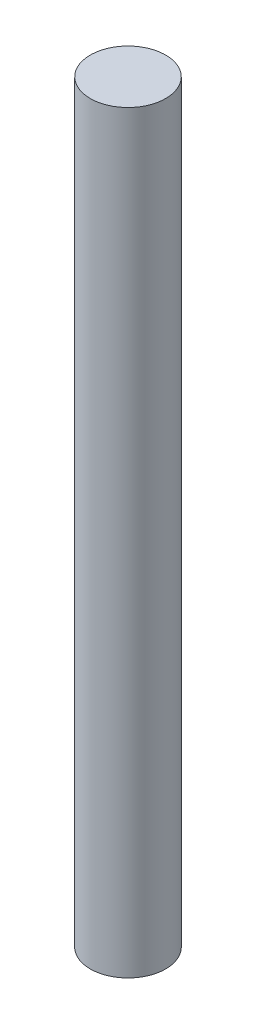
ISO-10303-21;
HEADER;
FILE_DESCRIPTION(('STEP AP214'),'2;1');
FILE_NAME('part.step','',(''),(''),'','','');
FILE_SCHEMA(('AUTOMOTIVE_DESIGN { 1 0 10303 214 1 1 1 1 }'));
ENDSEC;
DATA;
#1=APPLICATION_CONTEXT('core data for automotive mechanical design processes');
#2=APPLICATION_PROTOCOL_DEFINITION('international standard','automotive_design',2000,#1);
#3=PRODUCT_CONTEXT('',#1,'mechanical');
#4=PRODUCT('Part','Part','',(#3));
#5=PRODUCT_RELATED_PRODUCT_CATEGORY('part','',(#4));
#6=PRODUCT_DEFINITION_FORMATION('','',#4);
#7=PRODUCT_DEFINITION_CONTEXT('part definition',#1,'design');
#8=PRODUCT_DEFINITION('design','',#6,#7);
#9=PRODUCT_DEFINITION_SHAPE('','',#8);
#10=(LENGTH_UNIT() NAMED_UNIT(*) SI_UNIT(.MILLI.,.METRE.));
#11=(NAMED_UNIT(*) PLANE_ANGLE_UNIT() SI_UNIT($,.RADIAN.));
#12=(NAMED_UNIT(*) SI_UNIT($,.STERADIAN.) SOLID_ANGLE_UNIT());
#13=UNCERTAINTY_MEASURE_WITH_UNIT(LENGTH_MEASURE(1.E-05),#10,'distance_accuracy_value','');
#14=(GEOMETRIC_REPRESENTATION_CONTEXT(3) GLOBAL_UNCERTAINTY_ASSIGNED_CONTEXT((#13)) GLOBAL_UNIT_ASSIGNED_CONTEXT((#10,
#11,#12)) REPRESENTATION_CONTEXT('',''));
#15=CARTESIAN_POINT('',(0.,0.,0.));
#16=DIRECTION('',(0.,0.,1.));
#17=DIRECTION('',(1.,0.,0.));
#18=AXIS2_PLACEMENT_3D('',#15,#16,#17);
#19=CARTESIAN_POINT('',(0.,-10.,0.));
#20=DIRECTION('',(0.,1.,0.));
#21=DIRECTION('',(0.,0.,1.));
#22=AXIS2_PLACEMENT_3D('',#19,#20,#21);
#23=CYLINDRICAL_SURFACE('',#22,1.);
#24=CARTESIAN_POINT('',(0.,-10.,0.));
#25=DIRECTION('',(0.,1.,0.));
#26=DIRECTION('',(0.,0.,1.));
#27=AXIS2_PLACEMENT_3D('',#24,#25,#26);
#28=CIRCLE('',#27,1.);
#29=CARTESIAN_POINT('',(0.,-10.,1.));
#30=VERTEX_POINT('',#29);
#31=EDGE_CURVE('E10',#30,#30,#28,.T.);
#32=ORIENTED_EDGE('',*,*,#31,.T.);
#33=EDGE_LOOP('',(#32));
#34=FACE_BOUND('',#33,.T.);
#35=CARTESIAN_POINT('',(0.,10.,0.));
#36=DIRECTION('',(0.,1.,0.));
#37=DIRECTION('',(0.,0.,1.));
#38=AXIS2_PLACEMENT_3D('',#35,#36,#37);
#39=CIRCLE('',#38,1.);
#40=CARTESIAN_POINT('',(0.,10.,1.));
#41=VERTEX_POINT('',#40);
#42=EDGE_CURVE('E37',#41,#41,#39,.T.);
#43=ORIENTED_EDGE('',*,*,#42,.F.);
#44=EDGE_LOOP('',(#43));
#45=FACE_BOUND('',#44,.T.);
#46=ADVANCED_FACE('F31',(#34,#45),#23,.T.);
#47=CARTESIAN_POINT('',(0.,-10.,0.));
#48=DIRECTION('',(0.,1.,0.));
#49=DIRECTION('',(0.,0.,1.));
#50=AXIS2_PLACEMENT_3D('',#47,#48,#49);
#51=PLANE('',#50);
#52=ORIENTED_EDGE('',*,*,#31,.F.);
#53=EDGE_LOOP('',(#52));
#54=FACE_BOUND('',#53,.T.);
#55=ADVANCED_FACE('F46',(#54),#51,.F.);
#56=CARTESIAN_POINT('',(0.,10.,0.));
#57=DIRECTION('',(0.,1.,0.));
#58=DIRECTION('',(0.,0.,1.));
#59=AXIS2_PLACEMENT_3D('',#56,#57,#58);
#60=PLANE('',#59);
#61=ORIENTED_EDGE('',*,*,#42,.T.);
#62=EDGE_LOOP('',(#61));
#63=FACE_BOUND('',#62,.T.);
#64=ADVANCED_FACE('F43',(#63),#60,.T.);
#65=CLOSED_SHELL('',(#46,#55,#64));
#66=MANIFOLD_SOLID_BREP('B2',#65);
#67=ADVANCED_BREP_SHAPE_REPRESENTATION('',(#18,#66),#14);
#68=SHAPE_DEFINITION_REPRESENTATION(#9,#67);
ENDSEC;
END-ISO-10303-21;
